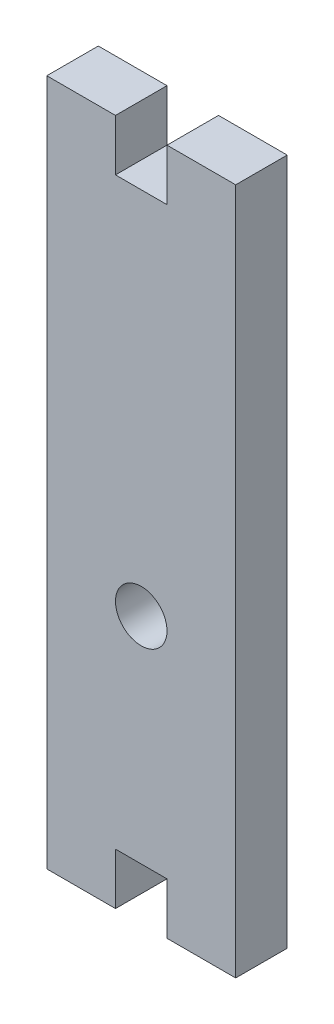
ISO-10303-21;
HEADER;
FILE_DESCRIPTION(('STEP AP214'),'2;1');
FILE_NAME('part.step','',(''),(''),'','','');
FILE_SCHEMA(('AUTOMOTIVE_DESIGN { 1 0 10303 214 1 1 1 1 }'));
ENDSEC;
DATA;
#1=APPLICATION_CONTEXT('core data for automotive mechanical design processes');
#2=APPLICATION_PROTOCOL_DEFINITION('international standard','automotive_design',2000,#1);
#3=PRODUCT_CONTEXT('',#1,'mechanical');
#4=PRODUCT('Part','Part','',(#3));
#5=PRODUCT_RELATED_PRODUCT_CATEGORY('part','',(#4));
#6=PRODUCT_DEFINITION_FORMATION('','',#4);
#7=PRODUCT_DEFINITION_CONTEXT('part definition',#1,'design');
#8=PRODUCT_DEFINITION('design','',#6,#7);
#9=PRODUCT_DEFINITION_SHAPE('','',#8);
#10=(LENGTH_UNIT() NAMED_UNIT(*) SI_UNIT(.MILLI.,.METRE.));
#11=(NAMED_UNIT(*) PLANE_ANGLE_UNIT() SI_UNIT($,.RADIAN.));
#12=(NAMED_UNIT(*) SI_UNIT($,.STERADIAN.) SOLID_ANGLE_UNIT());
#13=UNCERTAINTY_MEASURE_WITH_UNIT(LENGTH_MEASURE(1.E-05),#10,'distance_accuracy_value','');
#14=(GEOMETRIC_REPRESENTATION_CONTEXT(3) GLOBAL_UNCERTAINTY_ASSIGNED_CONTEXT((#13)) GLOBAL_UNIT_ASSIGNED_CONTEXT((#10,
#11,#12)) REPRESENTATION_CONTEXT('',''));
#15=CARTESIAN_POINT('',(0.,0.,0.));
#16=DIRECTION('',(0.,0.,1.));
#17=DIRECTION('',(1.,0.,0.));
#18=AXIS2_PLACEMENT_3D('',#15,#16,#17);
#19=CARTESIAN_POINT('',(0.,6.00000000000002,6.));
#20=DIRECTION('',(0.,1.,0.));
#21=DIRECTION('',(0.,0.,1.));
#22=AXIS2_PLACEMENT_3D('',#19,#20,#21);
#23=PLANE('',#22);
#24=DIRECTION('',(1.,0.,0.));
#25=VECTOR('',#24,1.);
#26=CARTESIAN_POINT('',(0.,6.00000000000002,0.));
#27=LINE('',#26,#25);
#28=CARTESIAN_POINT('',(-14.,6.00000000000002,0.));
#29=VERTEX_POINT('',#28);
#30=CARTESIAN_POINT('',(-8.00000000000002,6.00000000000002,0.));
#31=VERTEX_POINT('',#30);
#32=EDGE_CURVE('E202',#29,#31,#27,.T.);
#33=ORIENTED_EDGE('',*,*,#32,.T.);
#34=DIRECTION('',(0.,0.,-1.));
#35=VECTOR('',#34,1.);
#36=CARTESIAN_POINT('',(-8.00000000000002,6.00000000000002,6.));
#37=LINE('',#36,#35);
#38=CARTESIAN_POINT('',(-8.00000000000002,6.00000000000002,6.));
#39=VERTEX_POINT('',#38);
#40=EDGE_CURVE('E11',#39,#31,#37,.T.);
#41=ORIENTED_EDGE('',*,*,#40,.F.);
#42=DIRECTION('',(1.,0.,0.));
#43=VECTOR('',#42,1.);
#44=CARTESIAN_POINT('',(0.,6.00000000000002,6.));
#45=LINE('',#44,#43);
#46=CARTESIAN_POINT('',(-14.,6.00000000000002,6.));
#47=VERTEX_POINT('',#46);
#48=EDGE_CURVE('E163',#47,#39,#45,.T.);
#49=ORIENTED_EDGE('',*,*,#48,.F.);
#50=DIRECTION('',(0.,0.,-1.));
#51=VECTOR('',#50,1.);
#52=CARTESIAN_POINT('',(-14.,6.00000000000002,6.));
#53=LINE('',#52,#51);
#54=EDGE_CURVE('E154',#47,#29,#53,.T.);
#55=ORIENTED_EDGE('',*,*,#54,.T.);
#56=EDGE_LOOP('',(#33,#41,#49,#55));
#57=FACE_BOUND('',#56,.T.);
#58=ADVANCED_FACE('F37',(#57),#23,.F.);
#59=CARTESIAN_POINT('',(-8.00000000000001,0.,6.));
#60=DIRECTION('',(1.,0.,0.));
#61=DIRECTION('',(0.,1.,0.));
#62=AXIS2_PLACEMENT_3D('',#59,#60,#61);
#63=PLANE('',#62);
#64=DIRECTION('',(0.,-1.,0.));
#65=VECTOR('',#64,1.);
#66=CARTESIAN_POINT('',(-8.00000000000001,0.,0.));
#67=LINE('',#66,#65);
#68=CARTESIAN_POINT('',(-8.00000000000001,0.,0.));
#69=VERTEX_POINT('',#68);
#70=EDGE_CURVE('E196',#31,#69,#67,.T.);
#71=ORIENTED_EDGE('',*,*,#70,.T.);
#72=DIRECTION('',(0.,0.,-1.));
#73=VECTOR('',#72,1.);
#74=CARTESIAN_POINT('',(-8.00000000000001,0.,6.));
#75=LINE('',#74,#73);
#76=CARTESIAN_POINT('',(-8.00000000000001,0.,6.));
#77=VERTEX_POINT('',#76);
#78=EDGE_CURVE('E46',#77,#69,#75,.T.);
#79=ORIENTED_EDGE('',*,*,#78,.F.);
#80=DIRECTION('',(0.,-1.,0.));
#81=VECTOR('',#80,1.);
#82=CARTESIAN_POINT('',(-8.00000000000001,0.,6.));
#83=LINE('',#82,#81);
#84=EDGE_CURVE('E105',#39,#77,#83,.T.);
#85=ORIENTED_EDGE('',*,*,#84,.F.);
#86=ORIENTED_EDGE('',*,*,#40,.T.);
#87=EDGE_LOOP('',(#71,#79,#85,#86));
#88=FACE_BOUND('',#87,.T.);
#89=ADVANCED_FACE('F197',(#88),#63,.F.);
#90=CARTESIAN_POINT('',(0.,0.,6.));
#91=DIRECTION('',(0.,-1.,0.));
#92=DIRECTION('',(0.,0.,-1.));
#93=AXIS2_PLACEMENT_3D('',#90,#91,#92);
#94=PLANE('',#93);
#95=DIRECTION('',(-1.,0.,0.));
#96=VECTOR('',#95,1.);
#97=CARTESIAN_POINT('',(0.,0.,0.));
#98=LINE('',#97,#96);
#99=CARTESIAN_POINT('',(0.,0.,0.));
#100=VERTEX_POINT('',#99);
#101=EDGE_CURVE('E173',#100,#69,#98,.T.);
#102=ORIENTED_EDGE('',*,*,#101,.F.);
#103=DIRECTION('',(0.,0.,-1.));
#104=VECTOR('',#103,1.);
#105=CARTESIAN_POINT('',(0.,0.,6.));
#106=LINE('',#105,#104);
#107=CARTESIAN_POINT('',(0.,0.,6.));
#108=VERTEX_POINT('',#107);
#109=EDGE_CURVE('E191',#108,#100,#106,.T.);
#110=ORIENTED_EDGE('',*,*,#109,.F.);
#111=DIRECTION('',(-1.,0.,0.));
#112=VECTOR('',#111,1.);
#113=CARTESIAN_POINT('',(0.,0.,6.));
#114=LINE('',#113,#112);
#115=EDGE_CURVE('E153',#108,#77,#114,.T.);
#116=ORIENTED_EDGE('',*,*,#115,.T.);
#117=ORIENTED_EDGE('',*,*,#78,.T.);
#118=EDGE_LOOP('',(#102,#110,#116,#117));
#119=FACE_BOUND('',#118,.T.);
#120=ADVANCED_FACE('F194',(#119),#94,.T.);
#121=CARTESIAN_POINT('',(0.,0.,6.));
#122=DIRECTION('',(-1.,0.,0.));
#123=DIRECTION('',(0.,0.,1.));
#124=AXIS2_PLACEMENT_3D('',#121,#122,#123);
#125=PLANE('',#124);
#126=DIRECTION('',(0.,1.,0.));
#127=VECTOR('',#126,1.);
#128=CARTESIAN_POINT('',(0.,0.,0.));
#129=LINE('',#128,#127);
#130=CARTESIAN_POINT('',(0.,80.,0.));
#131=VERTEX_POINT('',#130);
#132=EDGE_CURVE('E207',#100,#131,#129,.T.);
#133=ORIENTED_EDGE('',*,*,#132,.T.);
#134=DIRECTION('',(0.,0.,-1.));
#135=VECTOR('',#134,1.);
#136=CARTESIAN_POINT('',(0.,80.,6.));
#137=LINE('',#136,#135);
#138=CARTESIAN_POINT('',(0.,80.,6.));
#139=VERTEX_POINT('',#138);
#140=EDGE_CURVE('E188',#139,#131,#137,.T.);
#141=ORIENTED_EDGE('',*,*,#140,.F.);
#142=DIRECTION('',(0.,1.,0.));
#143=VECTOR('',#142,1.);
#144=CARTESIAN_POINT('',(0.,0.,6.));
#145=LINE('',#144,#143);
#146=EDGE_CURVE('E159',#108,#139,#145,.T.);
#147=ORIENTED_EDGE('',*,*,#146,.F.);
#148=ORIENTED_EDGE('',*,*,#109,.T.);
#149=EDGE_LOOP('',(#133,#141,#147,#148));
#150=FACE_BOUND('',#149,.T.);
#151=ADVANCED_FACE('F266',(#150),#125,.F.);
#152=CARTESIAN_POINT('',(0.,80.,6.));
#153=DIRECTION('',(0.,-1.,0.));
#154=DIRECTION('',(0.,0.,-1.));
#155=AXIS2_PLACEMENT_3D('',#152,#153,#154);
#156=PLANE('',#155);
#157=DIRECTION('',(-1.,0.,0.));
#158=VECTOR('',#157,1.);
#159=CARTESIAN_POINT('',(0.,80.,0.));
#160=LINE('',#159,#158);
#161=CARTESIAN_POINT('',(-8.00000000000001,80.,0.));
#162=VERTEX_POINT('',#161);
#163=EDGE_CURVE('E208',#131,#162,#160,.T.);
#164=ORIENTED_EDGE('',*,*,#163,.T.);
#165=DIRECTION('',(0.,0.,-1.));
#166=VECTOR('',#165,1.);
#167=CARTESIAN_POINT('',(-8.00000000000001,80.,6.));
#168=LINE('',#167,#166);
#169=CARTESIAN_POINT('',(-8.00000000000001,80.,6.));
#170=VERTEX_POINT('',#169);
#171=EDGE_CURVE('E186',#170,#162,#168,.T.);
#172=ORIENTED_EDGE('',*,*,#171,.F.);
#173=DIRECTION('',(-1.,0.,0.));
#174=VECTOR('',#173,1.);
#175=CARTESIAN_POINT('',(0.,80.,6.));
#176=LINE('',#175,#174);
#177=EDGE_CURVE('E162',#139,#170,#176,.T.);
#178=ORIENTED_EDGE('',*,*,#177,.F.);
#179=ORIENTED_EDGE('',*,*,#140,.T.);
#180=EDGE_LOOP('',(#164,#172,#178,#179));
#181=FACE_BOUND('',#180,.T.);
#182=ADVANCED_FACE('F247',(#181),#156,.F.);
#183=CARTESIAN_POINT('',(-8.00000000000001,0.,6.));
#184=DIRECTION('',(-1.,0.,0.));
#185=DIRECTION('',(0.,0.,1.));
#186=AXIS2_PLACEMENT_3D('',#183,#184,#185);
#187=PLANE('',#186);
#188=DIRECTION('',(0.,1.,0.));
#189=VECTOR('',#188,1.);
#190=CARTESIAN_POINT('',(-8.00000000000001,0.,0.));
#191=LINE('',#190,#189);
#192=CARTESIAN_POINT('',(-8.00000000000001,74.,0.));
#193=VERTEX_POINT('',#192);
#194=EDGE_CURVE('E214',#193,#162,#191,.T.);
#195=ORIENTED_EDGE('',*,*,#194,.F.);
#196=DIRECTION('',(0.,0.,-1.));
#197=VECTOR('',#196,1.);
#198=CARTESIAN_POINT('',(-8.00000000000001,74.,6.));
#199=LINE('',#198,#197);
#200=CARTESIAN_POINT('',(-8.00000000000001,74.,6.));
#201=VERTEX_POINT('',#200);
#202=EDGE_CURVE('E184',#201,#193,#199,.T.);
#203=ORIENTED_EDGE('',*,*,#202,.F.);
#204=DIRECTION('',(0.,1.,0.));
#205=VECTOR('',#204,1.);
#206=CARTESIAN_POINT('',(-8.00000000000001,0.,6.));
#207=LINE('',#206,#205);
#208=EDGE_CURVE('E237',#201,#170,#207,.T.);
#209=ORIENTED_EDGE('',*,*,#208,.T.);
#210=ORIENTED_EDGE('',*,*,#171,.T.);
#211=EDGE_LOOP('',(#195,#203,#209,#210));
#212=FACE_BOUND('',#211,.T.);
#213=ADVANCED_FACE('F250',(#212),#187,.T.);
#214=CARTESIAN_POINT('',(0.,74.,6.));
#215=DIRECTION('',(0.,1.,0.));
#216=DIRECTION('',(0.,0.,1.));
#217=AXIS2_PLACEMENT_3D('',#214,#215,#216);
#218=PLANE('',#217);
#219=DIRECTION('',(1.,0.,0.));
#220=VECTOR('',#219,1.);
#221=CARTESIAN_POINT('',(0.,74.,0.));
#222=LINE('',#221,#220);
#223=CARTESIAN_POINT('',(-14.,74.,0.));
#224=VERTEX_POINT('',#223);
#225=EDGE_CURVE('E218',#224,#193,#222,.T.);
#226=ORIENTED_EDGE('',*,*,#225,.F.);
#227=DIRECTION('',(0.,0.,-1.));
#228=VECTOR('',#227,1.);
#229=CARTESIAN_POINT('',(-14.,74.,6.));
#230=LINE('',#229,#228);
#231=CARTESIAN_POINT('',(-14.,74.,6.));
#232=VERTEX_POINT('',#231);
#233=EDGE_CURVE('E182',#232,#224,#230,.T.);
#234=ORIENTED_EDGE('',*,*,#233,.F.);
#235=DIRECTION('',(1.,0.,0.));
#236=VECTOR('',#235,1.);
#237=CARTESIAN_POINT('',(0.,74.,6.));
#238=LINE('',#237,#236);
#239=EDGE_CURVE('E234',#232,#201,#238,.T.);
#240=ORIENTED_EDGE('',*,*,#239,.T.);
#241=ORIENTED_EDGE('',*,*,#202,.T.);
#242=EDGE_LOOP('',(#226,#234,#240,#241));
#243=FACE_BOUND('',#242,.T.);
#244=ADVANCED_FACE('F253',(#243),#218,.T.);
#245=CARTESIAN_POINT('',(-13.9999999999996,0.,6.));
#246=DIRECTION('',(1.,0.,0.));
#247=DIRECTION('',(0.,1.,0.));
#248=AXIS2_PLACEMENT_3D('',#245,#246,#247);
#249=PLANE('',#248);
#250=DIRECTION('',(0.,-1.,0.));
#251=VECTOR('',#250,1.);
#252=CARTESIAN_POINT('',(-13.9999999999996,0.,0.));
#253=LINE('',#252,#251);
#254=CARTESIAN_POINT('',(-14.,80.,0.));
#255=VERTEX_POINT('',#254);
#256=EDGE_CURVE('E220',#255,#224,#253,.T.);
#257=ORIENTED_EDGE('',*,*,#256,.F.);
#258=DIRECTION('',(0.,0.,-1.));
#259=VECTOR('',#258,1.);
#260=CARTESIAN_POINT('',(-14.,80.,6.));
#261=LINE('',#260,#259);
#262=CARTESIAN_POINT('',(-14.,80.,6.));
#263=VERTEX_POINT('',#262);
#264=EDGE_CURVE('E180',#263,#255,#261,.T.);
#265=ORIENTED_EDGE('',*,*,#264,.F.);
#266=DIRECTION('',(0.,-1.,0.));
#267=VECTOR('',#266,1.);
#268=CARTESIAN_POINT('',(-13.9999999999996,0.,6.));
#269=LINE('',#268,#267);
#270=EDGE_CURVE('E231',#263,#232,#269,.T.);
#271=ORIENTED_EDGE('',*,*,#270,.T.);
#272=ORIENTED_EDGE('',*,*,#233,.T.);
#273=EDGE_LOOP('',(#257,#265,#271,#272));
#274=FACE_BOUND('',#273,.T.);
#275=ADVANCED_FACE('F255',(#274),#249,.T.);
#276=CARTESIAN_POINT('',(-22.,80.,0.));
#277=VERTEX_POINT('',#276);
#278=EDGE_CURVE('E215',#255,#277,#160,.T.);
#279=ORIENTED_EDGE('',*,*,#278,.T.);
#280=DIRECTION('',(0.,0.,-1.));
#281=VECTOR('',#280,1.);
#282=CARTESIAN_POINT('',(-22.,80.,6.));
#283=LINE('',#282,#281);
#284=CARTESIAN_POINT('',(-22.,80.,6.));
#285=VERTEX_POINT('',#284);
#286=EDGE_CURVE('E142',#285,#277,#283,.T.);
#287=ORIENTED_EDGE('',*,*,#286,.F.);
#288=EDGE_CURVE('E148',#263,#285,#176,.T.);
#289=ORIENTED_EDGE('',*,*,#288,.F.);
#290=ORIENTED_EDGE('',*,*,#264,.T.);
#291=EDGE_LOOP('',(#279,#287,#289,#290));
#292=FACE_BOUND('',#291,.T.);
#293=ADVANCED_FACE('F256',(#292),#156,.F.);
#294=CARTESIAN_POINT('',(-22.,0.,6.));
#295=DIRECTION('',(-1.,0.,0.));
#296=DIRECTION('',(0.,0.,1.));
#297=AXIS2_PLACEMENT_3D('',#294,#295,#296);
#298=PLANE('',#297);
#299=DIRECTION('',(0.,1.,0.));
#300=VECTOR('',#299,1.);
#301=CARTESIAN_POINT('',(-22.,0.,0.));
#302=LINE('',#301,#300);
#303=CARTESIAN_POINT('',(-22.,0.,0.));
#304=VERTEX_POINT('',#303);
#305=EDGE_CURVE('E137',#304,#277,#302,.T.);
#306=ORIENTED_EDGE('',*,*,#305,.F.);
#307=DIRECTION('',(0.,0.,-1.));
#308=VECTOR('',#307,1.);
#309=CARTESIAN_POINT('',(-22.,0.,6.));
#310=LINE('',#309,#308);
#311=CARTESIAN_POINT('',(-22.,0.,6.));
#312=VERTEX_POINT('',#311);
#313=EDGE_CURVE('E132',#312,#304,#310,.T.);
#314=ORIENTED_EDGE('',*,*,#313,.F.);
#315=DIRECTION('',(0.,1.,0.));
#316=VECTOR('',#315,1.);
#317=CARTESIAN_POINT('',(-22.,0.,6.));
#318=LINE('',#317,#316);
#319=EDGE_CURVE('E135',#312,#285,#318,.T.);
#320=ORIENTED_EDGE('',*,*,#319,.T.);
#321=ORIENTED_EDGE('',*,*,#286,.T.);
#322=EDGE_LOOP('',(#306,#314,#320,#321));
#323=FACE_BOUND('',#322,.T.);
#324=ADVANCED_FACE('F134',(#323),#298,.T.);
#325=CARTESIAN_POINT('',(-14.,0.,0.));
#326=VERTEX_POINT('',#325);
#327=EDGE_CURVE('E170',#326,#304,#98,.T.);
#328=ORIENTED_EDGE('',*,*,#327,.F.);
#329=DIRECTION('',(0.,0.,-1.));
#330=VECTOR('',#329,1.);
#331=CARTESIAN_POINT('',(-14.,0.,6.));
#332=LINE('',#331,#330);
#333=CARTESIAN_POINT('',(-14.,0.,6.));
#334=VERTEX_POINT('',#333);
#335=EDGE_CURVE('E94',#334,#326,#332,.T.);
#336=ORIENTED_EDGE('',*,*,#335,.F.);
#337=EDGE_CURVE('E145',#334,#312,#114,.T.);
#338=ORIENTED_EDGE('',*,*,#337,.T.);
#339=ORIENTED_EDGE('',*,*,#313,.T.);
#340=EDGE_LOOP('',(#328,#336,#338,#339));
#341=FACE_BOUND('',#340,.T.);
#342=ADVANCED_FACE('F151',(#341),#94,.T.);
#343=CARTESIAN_POINT('',(-11.,31.,6.));
#344=DIRECTION('',(0.,0.,-1.));
#345=DIRECTION('',(-1.,0.,0.));
#346=AXIS2_PLACEMENT_3D('',#343,#344,#345);
#347=CYLINDRICAL_SURFACE('',#346,3.);
#348=CARTESIAN_POINT('',(-11.,31.,6.));
#349=DIRECTION('',(0.,0.,1.));
#350=DIRECTION('',(1.,0.,0.));
#351=AXIS2_PLACEMENT_3D('',#348,#349,#350);
#352=CIRCLE('',#351,3.);
#353=CARTESIAN_POINT('',(-8.,31.,6.));
#354=VERTEX_POINT('',#353);
#355=EDGE_CURVE('E164',#354,#354,#352,.T.);
#356=ORIENTED_EDGE('',*,*,#355,.T.);
#357=EDGE_LOOP('',(#356));
#358=FACE_BOUND('',#357,.T.);
#359=CARTESIAN_POINT('',(-11.,31.,0.));
#360=DIRECTION('',(0.,0.,1.));
#361=DIRECTION('',(1.,0.,0.));
#362=AXIS2_PLACEMENT_3D('',#359,#360,#361);
#363=CIRCLE('',#362,3.);
#364=CARTESIAN_POINT('',(-8.,31.,0.));
#365=VERTEX_POINT('',#364);
#366=EDGE_CURVE('E227',#365,#365,#363,.T.);
#367=ORIENTED_EDGE('',*,*,#366,.F.);
#368=EDGE_LOOP('',(#367));
#369=FACE_BOUND('',#368,.T.);
#370=ADVANCED_FACE('F39',(#358,#369),#347,.F.);
#371=CARTESIAN_POINT('',(-14.,0.,6.));
#372=DIRECTION('',(-1.,0.,0.));
#373=DIRECTION('',(0.,0.,1.));
#374=AXIS2_PLACEMENT_3D('',#371,#372,#373);
#375=PLANE('',#374);
#376=DIRECTION('',(0.,1.,0.));
#377=VECTOR('',#376,1.);
#378=CARTESIAN_POINT('',(-14.,0.,0.));
#379=LINE('',#378,#377);
#380=EDGE_CURVE('E97',#326,#29,#379,.T.);
#381=ORIENTED_EDGE('',*,*,#380,.T.);
#382=ORIENTED_EDGE('',*,*,#54,.F.);
#383=DIRECTION('',(0.,1.,0.));
#384=VECTOR('',#383,1.);
#385=CARTESIAN_POINT('',(-14.,0.,6.));
#386=LINE('',#385,#384);
#387=EDGE_CURVE('E54',#334,#47,#386,.T.);
#388=ORIENTED_EDGE('',*,*,#387,.F.);
#389=ORIENTED_EDGE('',*,*,#335,.T.);
#390=EDGE_LOOP('',(#381,#382,#388,#389));
#391=FACE_BOUND('',#390,.T.);
#392=ADVANCED_FACE('F314',(#391),#375,.F.);
#393=CARTESIAN_POINT('',(0.,0.,6.));
#394=DIRECTION('',(0.,0.,1.));
#395=DIRECTION('',(1.,0.,0.));
#396=AXIS2_PLACEMENT_3D('',#393,#394,#395);
#397=PLANE('',#396);
#398=ORIENTED_EDGE('',*,*,#355,.F.);
#399=EDGE_LOOP('',(#398));
#400=FACE_BOUND('',#399,.T.);
#401=ORIENTED_EDGE('',*,*,#48,.T.);
#402=ORIENTED_EDGE('',*,*,#84,.T.);
#403=ORIENTED_EDGE('',*,*,#115,.F.);
#404=ORIENTED_EDGE('',*,*,#146,.T.);
#405=ORIENTED_EDGE('',*,*,#177,.T.);
#406=ORIENTED_EDGE('',*,*,#208,.F.);
#407=ORIENTED_EDGE('',*,*,#239,.F.);
#408=ORIENTED_EDGE('',*,*,#270,.F.);
#409=ORIENTED_EDGE('',*,*,#288,.T.);
#410=ORIENTED_EDGE('',*,*,#319,.F.);
#411=ORIENTED_EDGE('',*,*,#337,.F.);
#412=ORIENTED_EDGE('',*,*,#387,.T.);
#413=EDGE_LOOP('',(#401,#402,#403,#404,#405,#406,#407,#408,#409,#410,#411,#412));
#414=FACE_BOUND('',#413,.T.);
#415=ADVANCED_FACE('F144',(#400,#414),#397,.T.);
#416=CARTESIAN_POINT('',(0.,0.,0.));
#417=DIRECTION('',(0.,0.,1.));
#418=DIRECTION('',(1.,0.,0.));
#419=AXIS2_PLACEMENT_3D('',#416,#417,#418);
#420=PLANE('',#419);
#421=ORIENTED_EDGE('',*,*,#366,.T.);
#422=EDGE_LOOP('',(#421));
#423=FACE_BOUND('',#422,.T.);
#424=ORIENTED_EDGE('',*,*,#32,.F.);
#425=ORIENTED_EDGE('',*,*,#380,.F.);
#426=ORIENTED_EDGE('',*,*,#327,.T.);
#427=ORIENTED_EDGE('',*,*,#305,.T.);
#428=ORIENTED_EDGE('',*,*,#278,.F.);
#429=ORIENTED_EDGE('',*,*,#256,.T.);
#430=ORIENTED_EDGE('',*,*,#225,.T.);
#431=ORIENTED_EDGE('',*,*,#194,.T.);
#432=ORIENTED_EDGE('',*,*,#163,.F.);
#433=ORIENTED_EDGE('',*,*,#132,.F.);
#434=ORIENTED_EDGE('',*,*,#101,.T.);
#435=ORIENTED_EDGE('',*,*,#70,.F.);
#436=EDGE_LOOP('',(#424,#425,#426,#427,#428,#429,#430,#431,#432,#433,#434,#435));
#437=FACE_BOUND('',#436,.T.);
#438=ADVANCED_FACE('F205',(#423,#437),#420,.F.);
#439=CLOSED_SHELL('',(#58,#89,#120,#151,#182,#213,#244,#275,#293,#324,#342,#370,#392,#415,#438));
#440=MANIFOLD_SOLID_BREP('B2',#439);
#441=ADVANCED_BREP_SHAPE_REPRESENTATION('',(#18,#440),#14);
#442=SHAPE_DEFINITION_REPRESENTATION(#9,#441);
ENDSEC;
END-ISO-10303-21;
